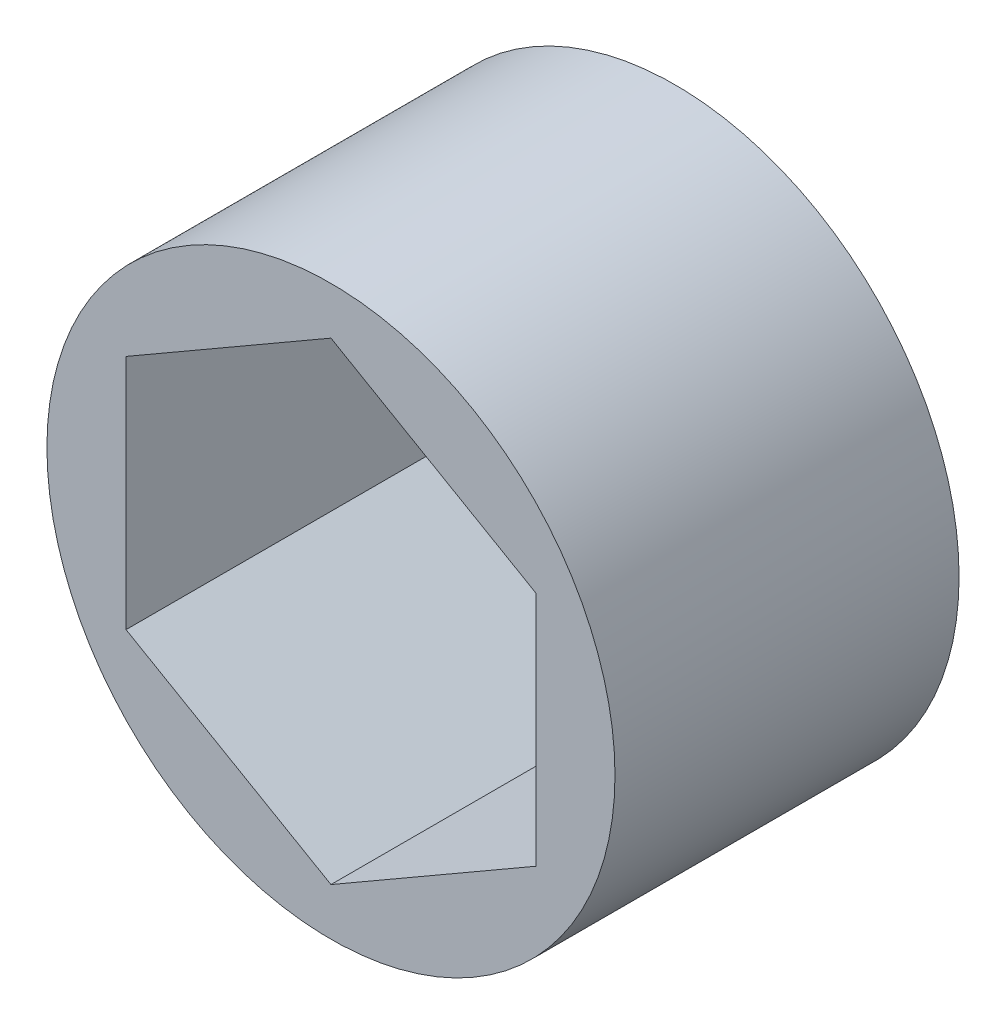
ISO-10303-21;
HEADER;
FILE_DESCRIPTION(('STEP AP214'),'2;1');
FILE_NAME('part.step','',(''),(''),'','','');
FILE_SCHEMA(('AUTOMOTIVE_DESIGN { 1 0 10303 214 1 1 1 1 }'));
ENDSEC;
DATA;
#1=APPLICATION_CONTEXT('core data for automotive mechanical design processes');
#2=APPLICATION_PROTOCOL_DEFINITION('international standard','automotive_design',2000,#1);
#3=PRODUCT_CONTEXT('',#1,'mechanical');
#4=PRODUCT('Part','Part','',(#3));
#5=PRODUCT_RELATED_PRODUCT_CATEGORY('part','',(#4));
#6=PRODUCT_DEFINITION_FORMATION('','',#4);
#7=PRODUCT_DEFINITION_CONTEXT('part definition',#1,'design');
#8=PRODUCT_DEFINITION('design','',#6,#7);
#9=PRODUCT_DEFINITION_SHAPE('','',#8);
#10=(LENGTH_UNIT() NAMED_UNIT(*) SI_UNIT(.MILLI.,.METRE.));
#11=(NAMED_UNIT(*) PLANE_ANGLE_UNIT() SI_UNIT($,.RADIAN.));
#12=(NAMED_UNIT(*) SI_UNIT($,.STERADIAN.) SOLID_ANGLE_UNIT());
#13=UNCERTAINTY_MEASURE_WITH_UNIT(LENGTH_MEASURE(1.E-05),#10,'distance_accuracy_value','');
#14=(GEOMETRIC_REPRESENTATION_CONTEXT(3) GLOBAL_UNCERTAINTY_ASSIGNED_CONTEXT((#13)) GLOBAL_UNIT_ASSIGNED_CONTEXT((#10,
#11,#12)) REPRESENTATION_CONTEXT('',''));
#15=CARTESIAN_POINT('',(0.,0.,0.));
#16=DIRECTION('',(0.,0.,1.));
#17=DIRECTION('',(1.,0.,0.));
#18=AXIS2_PLACEMENT_3D('',#15,#16,#17);
#19=CARTESIAN_POINT('',(0.,0.,10.7696));
#20=DIRECTION('',(0.,0.,1.));
#21=DIRECTION('',(1.,0.,0.));
#22=AXIS2_PLACEMENT_3D('',#19,#20,#21);
#23=PLANE('',#22);
#24=CARTESIAN_POINT('',(0.,0.,10.7696));
#25=DIRECTION('',(0.,0.,1.));
#26=DIRECTION('',(1.,0.,0.));
#27=AXIS2_PLACEMENT_3D('',#24,#25,#26);
#28=CIRCLE('',#27,8.89);
#29=CARTESIAN_POINT('',(8.89,0.,10.7696));
#30=VERTEX_POINT('',#29);
#31=EDGE_CURVE('E11',#30,#30,#28,.T.);
#32=ORIENTED_EDGE('',*,*,#31,.T.);
#33=EDGE_LOOP('',(#32));
#34=FACE_BOUND('',#33,.T.);
#35=DIRECTION('',(-0.866025403784439,-0.5,0.));
#36=VECTOR('',#35,1.);
#37=CARTESIAN_POINT('',(0.,7.40567190289533,10.7696));
#38=LINE('',#37,#36);
#39=CARTESIAN_POINT('',(0.,7.40567190289533,10.7696));
#40=VERTEX_POINT('',#39);
#41=CARTESIAN_POINT('',(-6.4135,3.70283595144767,10.7696));
#42=VERTEX_POINT('',#41);
#43=EDGE_CURVE('E108',#40,#42,#38,.T.);
#44=ORIENTED_EDGE('',*,*,#43,.F.);
#45=DIRECTION('',(-0.866025403784439,0.5,0.));
#46=VECTOR('',#45,1.);
#47=CARTESIAN_POINT('',(6.4135,3.70283595144767,10.7696));
#48=LINE('',#47,#46);
#49=CARTESIAN_POINT('',(6.4135,3.70283595144767,10.7696));
#50=VERTEX_POINT('',#49);
#51=EDGE_CURVE('E99',#50,#40,#48,.T.);
#52=ORIENTED_EDGE('',*,*,#51,.F.);
#53=DIRECTION('',(0.,1.,0.));
#54=VECTOR('',#53,1.);
#55=CARTESIAN_POINT('',(6.4135,-3.70283595144767,10.7696));
#56=LINE('',#55,#54);
#57=CARTESIAN_POINT('',(6.4135,-3.70283595144767,10.7696));
#58=VERTEX_POINT('',#57);
#59=EDGE_CURVE('E133',#58,#50,#56,.T.);
#60=ORIENTED_EDGE('',*,*,#59,.F.);
#61=DIRECTION('',(0.866025403784439,0.5,0.));
#62=VECTOR('',#61,1.);
#63=CARTESIAN_POINT('',(0.,-7.40567190289533,10.7696));
#64=LINE('',#63,#62);
#65=CARTESIAN_POINT('',(0.,-7.40567190289533,10.7696));
#66=VERTEX_POINT('',#65);
#67=EDGE_CURVE('E130',#66,#58,#64,.T.);
#68=ORIENTED_EDGE('',*,*,#67,.F.);
#69=DIRECTION('',(0.866025403784439,-0.5,0.));
#70=VECTOR('',#69,1.);
#71=CARTESIAN_POINT('',(-6.4135,-3.70283595144766,10.7696));
#72=LINE('',#71,#70);
#73=CARTESIAN_POINT('',(-6.4135,-3.70283595144766,10.7696));
#74=VERTEX_POINT('',#73);
#75=EDGE_CURVE('E125',#74,#66,#72,.T.);
#76=ORIENTED_EDGE('',*,*,#75,.F.);
#77=DIRECTION('',(0.,-1.,0.));
#78=VECTOR('',#77,1.);
#79=CARTESIAN_POINT('',(-6.4135,3.70283595144767,10.7696));
#80=LINE('',#79,#78);
#81=EDGE_CURVE('E121',#42,#74,#80,.T.);
#82=ORIENTED_EDGE('',*,*,#81,.F.);
#83=EDGE_LOOP('',(#44,#52,#60,#68,#76,#82));
#84=FACE_BOUND('',#83,.T.);
#85=ADVANCED_FACE('F45',(#34,#84),#23,.T.);
#86=CARTESIAN_POINT('',(0.,0.,0.));
#87=DIRECTION('',(0.,0.,1.));
#88=DIRECTION('',(1.,0.,0.));
#89=AXIS2_PLACEMENT_3D('',#86,#87,#88);
#90=PLANE('',#89);
#91=CARTESIAN_POINT('',(0.,0.,0.));
#92=DIRECTION('',(0.,0.,1.));
#93=DIRECTION('',(1.,0.,0.));
#94=AXIS2_PLACEMENT_3D('',#91,#92,#93);
#95=CIRCLE('',#94,8.89);
#96=CARTESIAN_POINT('',(8.89,0.,0.));
#97=VERTEX_POINT('',#96);
#98=EDGE_CURVE('E49',#97,#97,#95,.T.);
#99=ORIENTED_EDGE('',*,*,#98,.F.);
#100=EDGE_LOOP('',(#99));
#101=FACE_BOUND('',#100,.T.);
#102=DIRECTION('',(-0.866025403784439,0.5,0.));
#103=VECTOR('',#102,1.);
#104=CARTESIAN_POINT('',(6.4135,3.70283595144767,0.));
#105=LINE('',#104,#103);
#106=CARTESIAN_POINT('',(6.4135,3.70283595144767,0.));
#107=VERTEX_POINT('',#106);
#108=CARTESIAN_POINT('',(0.,7.40567190289533,0.));
#109=VERTEX_POINT('',#108);
#110=EDGE_CURVE('E69',#107,#109,#105,.T.);
#111=ORIENTED_EDGE('',*,*,#110,.T.);
#112=DIRECTION('',(-0.866025403784439,-0.5,0.));
#113=VECTOR('',#112,1.);
#114=CARTESIAN_POINT('',(0.,7.40567190289533,0.));
#115=LINE('',#114,#113);
#116=CARTESIAN_POINT('',(-6.4135,3.70283595144767,0.));
#117=VERTEX_POINT('',#116);
#118=EDGE_CURVE('E115',#109,#117,#115,.T.);
#119=ORIENTED_EDGE('',*,*,#118,.T.);
#120=DIRECTION('',(0.,-1.,0.));
#121=VECTOR('',#120,1.);
#122=CARTESIAN_POINT('',(-6.4135,3.70283595144767,0.));
#123=LINE('',#122,#121);
#124=CARTESIAN_POINT('',(-6.4135,-3.70283595144766,0.));
#125=VERTEX_POINT('',#124);
#126=EDGE_CURVE('E140',#117,#125,#123,.T.);
#127=ORIENTED_EDGE('',*,*,#126,.T.);
#128=DIRECTION('',(0.866025403784439,-0.5,0.));
#129=VECTOR('',#128,1.);
#130=CARTESIAN_POINT('',(-6.4135,-3.70283595144766,0.));
#131=LINE('',#130,#129);
#132=CARTESIAN_POINT('',(0.,-7.40567190289533,0.));
#133=VERTEX_POINT('',#132);
#134=EDGE_CURVE('E144',#125,#133,#131,.T.);
#135=ORIENTED_EDGE('',*,*,#134,.T.);
#136=DIRECTION('',(0.866025403784439,0.5,0.));
#137=VECTOR('',#136,1.);
#138=CARTESIAN_POINT('',(0.,-7.40567190289533,0.));
#139=LINE('',#138,#137);
#140=CARTESIAN_POINT('',(6.4135,-3.70283595144767,0.));
#141=VERTEX_POINT('',#140);
#142=EDGE_CURVE('E148',#133,#141,#139,.T.);
#143=ORIENTED_EDGE('',*,*,#142,.T.);
#144=DIRECTION('',(0.,1.,0.));
#145=VECTOR('',#144,1.);
#146=CARTESIAN_POINT('',(6.4135,-3.70283595144767,0.));
#147=LINE('',#146,#145);
#148=EDGE_CURVE('E109',#141,#107,#147,.T.);
#149=ORIENTED_EDGE('',*,*,#148,.T.);
#150=EDGE_LOOP('',(#111,#119,#127,#135,#143,#149));
#151=FACE_BOUND('',#150,.T.);
#152=ADVANCED_FACE('F172',(#101,#151),#90,.F.);
#153=CARTESIAN_POINT('',(0.,0.,10.7696));
#154=DIRECTION('',(0.,0.,-1.));
#155=DIRECTION('',(-1.,0.,0.));
#156=AXIS2_PLACEMENT_3D('',#153,#154,#155);
#157=CYLINDRICAL_SURFACE('',#156,8.89);
#158=ORIENTED_EDGE('',*,*,#31,.F.);
#159=EDGE_LOOP('',(#158));
#160=FACE_BOUND('',#159,.T.);
#161=ORIENTED_EDGE('',*,*,#98,.T.);
#162=EDGE_LOOP('',(#161));
#163=FACE_BOUND('',#162,.T.);
#164=ADVANCED_FACE('F47',(#160,#163),#157,.T.);
#165=CARTESIAN_POINT('',(6.4135,3.70283595144767,10.7696));
#166=DIRECTION('',(-0.5,-0.866025403784439,0.));
#167=DIRECTION('',(0.866025403784439,-0.5,0.));
#168=AXIS2_PLACEMENT_3D('',#165,#166,#167);
#169=PLANE('',#168);
#170=ORIENTED_EDGE('',*,*,#110,.F.);
#171=DIRECTION('',(0.,0.,-1.));
#172=VECTOR('',#171,1.);
#173=CARTESIAN_POINT('',(6.4135,3.70283595144767,10.7696));
#174=LINE('',#173,#172);
#175=EDGE_CURVE('E103',#50,#107,#174,.T.);
#176=ORIENTED_EDGE('',*,*,#175,.F.);
#177=ORIENTED_EDGE('',*,*,#51,.T.);
#178=DIRECTION('',(0.,0.,-1.));
#179=VECTOR('',#178,1.);
#180=CARTESIAN_POINT('',(0.,7.40567190289533,10.7696));
#181=LINE('',#180,#179);
#182=EDGE_CURVE('E102',#40,#109,#181,.T.);
#183=ORIENTED_EDGE('',*,*,#182,.T.);
#184=EDGE_LOOP('',(#170,#176,#177,#183));
#185=FACE_BOUND('',#184,.T.);
#186=ADVANCED_FACE('F101',(#185),#169,.T.);
#187=CARTESIAN_POINT('',(0.,7.40567190289533,10.7696));
#188=DIRECTION('',(0.5,-0.866025403784439,0.));
#189=DIRECTION('',(0.866025403784439,0.5,0.));
#190=AXIS2_PLACEMENT_3D('',#187,#188,#189);
#191=PLANE('',#190);
#192=ORIENTED_EDGE('',*,*,#118,.F.);
#193=ORIENTED_EDGE('',*,*,#182,.F.);
#194=ORIENTED_EDGE('',*,*,#43,.T.);
#195=DIRECTION('',(0.,0.,-1.));
#196=VECTOR('',#195,1.);
#197=CARTESIAN_POINT('',(-6.4135,3.70283595144767,10.7696));
#198=LINE('',#197,#196);
#199=EDGE_CURVE('E117',#42,#117,#198,.T.);
#200=ORIENTED_EDGE('',*,*,#199,.T.);
#201=EDGE_LOOP('',(#192,#193,#194,#200));
#202=FACE_BOUND('',#201,.T.);
#203=ADVANCED_FACE('F112',(#202),#191,.T.);
#204=CARTESIAN_POINT('',(-6.4135,3.70283595144767,10.7696));
#205=DIRECTION('',(1.,0.,0.));
#206=DIRECTION('',(0.,1.,0.));
#207=AXIS2_PLACEMENT_3D('',#204,#205,#206);
#208=PLANE('',#207);
#209=ORIENTED_EDGE('',*,*,#126,.F.);
#210=ORIENTED_EDGE('',*,*,#199,.F.);
#211=ORIENTED_EDGE('',*,*,#81,.T.);
#212=DIRECTION('',(0.,0.,-1.));
#213=VECTOR('',#212,1.);
#214=CARTESIAN_POINT('',(-6.4135,-3.70283595144766,10.7696));
#215=LINE('',#214,#213);
#216=EDGE_CURVE('E162',#74,#125,#215,.T.);
#217=ORIENTED_EDGE('',*,*,#216,.T.);
#218=EDGE_LOOP('',(#209,#210,#211,#217));
#219=FACE_BOUND('',#218,.T.);
#220=ADVANCED_FACE('F168',(#219),#208,.T.);
#221=CARTESIAN_POINT('',(-6.4135,-3.70283595144766,10.7696));
#222=DIRECTION('',(0.5,0.866025403784439,0.));
#223=DIRECTION('',(-0.866025403784439,0.5,0.));
#224=AXIS2_PLACEMENT_3D('',#221,#222,#223);
#225=PLANE('',#224);
#226=ORIENTED_EDGE('',*,*,#134,.F.);
#227=ORIENTED_EDGE('',*,*,#216,.F.);
#228=ORIENTED_EDGE('',*,*,#75,.T.);
#229=DIRECTION('',(0.,0.,-1.));
#230=VECTOR('',#229,1.);
#231=CARTESIAN_POINT('',(0.,-7.40567190289533,10.7696));
#232=LINE('',#231,#230);
#233=EDGE_CURVE('E159',#66,#133,#232,.T.);
#234=ORIENTED_EDGE('',*,*,#233,.T.);
#235=EDGE_LOOP('',(#226,#227,#228,#234));
#236=FACE_BOUND('',#235,.T.);
#237=ADVANCED_FACE('F180',(#236),#225,.T.);
#238=CARTESIAN_POINT('',(0.,-7.40567190289533,10.7696));
#239=DIRECTION('',(-0.5,0.866025403784439,0.));
#240=DIRECTION('',(-0.866025403784439,-0.5,0.));
#241=AXIS2_PLACEMENT_3D('',#238,#239,#240);
#242=PLANE('',#241);
#243=ORIENTED_EDGE('',*,*,#142,.F.);
#244=ORIENTED_EDGE('',*,*,#233,.F.);
#245=ORIENTED_EDGE('',*,*,#67,.T.);
#246=DIRECTION('',(0.,0.,-1.));
#247=VECTOR('',#246,1.);
#248=CARTESIAN_POINT('',(6.4135,-3.70283595144767,10.7696));
#249=LINE('',#248,#247);
#250=EDGE_CURVE('E61',#58,#141,#249,.T.);
#251=ORIENTED_EDGE('',*,*,#250,.T.);
#252=EDGE_LOOP('',(#243,#244,#245,#251));
#253=FACE_BOUND('',#252,.T.);
#254=ADVANCED_FACE('F178',(#253),#242,.T.);
#255=CARTESIAN_POINT('',(6.4135,-3.70283595144767,10.7696));
#256=DIRECTION('',(-1.,0.,0.));
#257=DIRECTION('',(0.,-1.,0.));
#258=AXIS2_PLACEMENT_3D('',#255,#256,#257);
#259=PLANE('',#258);
#260=ORIENTED_EDGE('',*,*,#148,.F.);
#261=ORIENTED_EDGE('',*,*,#250,.F.);
#262=ORIENTED_EDGE('',*,*,#59,.T.);
#263=ORIENTED_EDGE('',*,*,#175,.T.);
#264=EDGE_LOOP('',(#260,#261,#262,#263));
#265=FACE_BOUND('',#264,.T.);
#266=ADVANCED_FACE('F174',(#265),#259,.T.);
#267=CLOSED_SHELL('',(#85,#152,#164,#186,#203,#220,#237,#254,#266));
#268=MANIFOLD_SOLID_BREP('B2',#267);
#269=ADVANCED_BREP_SHAPE_REPRESENTATION('',(#18,#268),#14);
#270=SHAPE_DEFINITION_REPRESENTATION(#9,#269);
ENDSEC;
END-ISO-10303-21;
